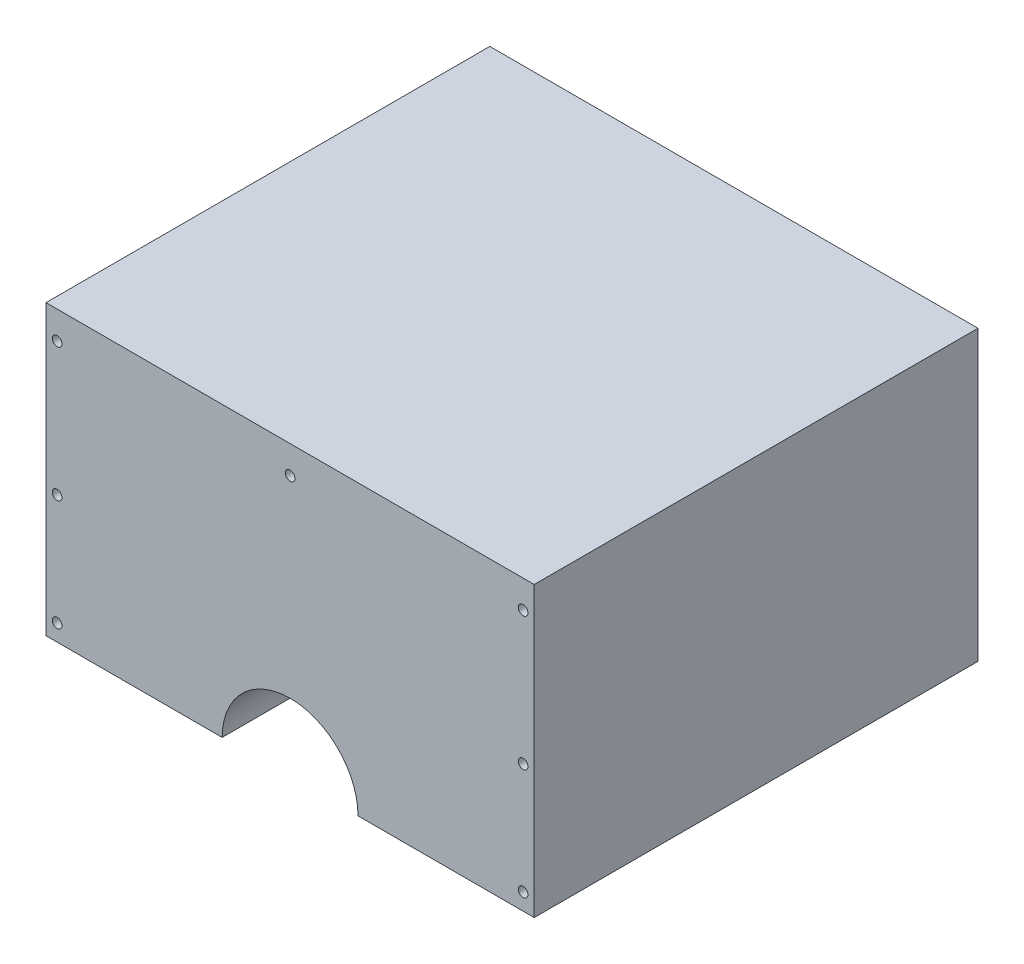
ISO-10303-21;
HEADER;
FILE_DESCRIPTION(('STEP AP214'),'2;1');
FILE_NAME('part.step','',(''),(''),'','','');
FILE_SCHEMA(('AUTOMOTIVE_DESIGN { 1 0 10303 214 1 1 1 1 }'));
ENDSEC;
DATA;
#1=APPLICATION_CONTEXT('core data for automotive mechanical design processes');
#2=APPLICATION_PROTOCOL_DEFINITION('international standard','automotive_design',2000,#1);
#3=PRODUCT_CONTEXT('',#1,'mechanical');
#4=PRODUCT('Part','Part','',(#3));
#5=PRODUCT_RELATED_PRODUCT_CATEGORY('part','',(#4));
#6=PRODUCT_DEFINITION_FORMATION('','',#4);
#7=PRODUCT_DEFINITION_CONTEXT('part definition',#1,'design');
#8=PRODUCT_DEFINITION('design','',#6,#7);
#9=PRODUCT_DEFINITION_SHAPE('','',#8);
#10=(LENGTH_UNIT() NAMED_UNIT(*) SI_UNIT(.MILLI.,.METRE.));
#11=(NAMED_UNIT(*) PLANE_ANGLE_UNIT() SI_UNIT($,.RADIAN.));
#12=(NAMED_UNIT(*) SI_UNIT($,.STERADIAN.) SOLID_ANGLE_UNIT());
#13=UNCERTAINTY_MEASURE_WITH_UNIT(LENGTH_MEASURE(1.E-05),#10,'distance_accuracy_value','');
#14=(GEOMETRIC_REPRESENTATION_CONTEXT(3) GLOBAL_UNCERTAINTY_ASSIGNED_CONTEXT((#13)) GLOBAL_UNIT_ASSIGNED_CONTEXT((#10,
#11,#12)) REPRESENTATION_CONTEXT('',''));
#15=CARTESIAN_POINT('',(0.,0.,0.));
#16=DIRECTION('',(0.,0.,1.));
#17=DIRECTION('',(1.,0.,0.));
#18=AXIS2_PLACEMENT_3D('',#15,#16,#17);
#19=CARTESIAN_POINT('',(0.,0.,254.));
#20=DIRECTION('',(0.,1.,0.));
#21=DIRECTION('',(0.,0.,1.));
#22=AXIS2_PLACEMENT_3D('',#19,#20,#21);
#23=PLANE('',#22);
#24=DIRECTION('',(0.,0.,-1.));
#25=VECTOR('',#24,1.);
#26=CARTESIAN_POINT('',(178.5874,0.,254.));
#27=LINE('',#26,#25);
#28=CARTESIAN_POINT('',(178.5874,0.,0.));
#29=VERTEX_POINT('',#28);
#30=CARTESIAN_POINT('',(178.5874,0.,254.));
#31=VERTEX_POINT('',#30);
#32=EDGE_CURVE('E99',#29,#31,#27,.F.);
#33=ORIENTED_EDGE('',*,*,#32,.F.);
#34=DIRECTION('',(1.,0.,0.));
#35=VECTOR('',#34,1.);
#36=CARTESIAN_POINT('',(0.,0.,0.));
#37=LINE('',#36,#35);
#38=CARTESIAN_POINT('',(279.4,0.,0.));
#39=VERTEX_POINT('',#38);
#40=EDGE_CURVE('E125',#29,#39,#37,.T.);
#41=ORIENTED_EDGE('',*,*,#40,.T.);
#42=DIRECTION('',(0.,0.,-1.));
#43=VECTOR('',#42,1.);
#44=CARTESIAN_POINT('',(279.4,0.,254.));
#45=LINE('',#44,#43);
#46=CARTESIAN_POINT('',(279.4,0.,254.));
#47=VERTEX_POINT('',#46);
#48=EDGE_CURVE('E47',#47,#39,#45,.T.);
#49=ORIENTED_EDGE('',*,*,#48,.F.);
#50=DIRECTION('',(1.,0.,0.));
#51=VECTOR('',#50,1.);
#52=CARTESIAN_POINT('',(0.,0.,254.));
#53=LINE('',#52,#51);
#54=EDGE_CURVE('E110',#31,#47,#53,.T.);
#55=ORIENTED_EDGE('',*,*,#54,.F.);
#56=EDGE_LOOP('',(#33,#41,#49,#55));
#57=FACE_BOUND('',#56,.T.);
#58=ADVANCED_FACE('F39',(#57),#23,.F.);
#59=DIRECTION('',(0.,0.,-1.));
#60=VECTOR('',#59,1.);
#61=CARTESIAN_POINT('',(100.8126,0.,254.));
#62=LINE('',#61,#60);
#63=CARTESIAN_POINT('',(100.8126,0.,254.));
#64=VERTEX_POINT('',#63);
#65=CARTESIAN_POINT('',(100.8126,0.,0.));
#66=VERTEX_POINT('',#65);
#67=EDGE_CURVE('E54',#64,#66,#62,.T.);
#68=ORIENTED_EDGE('',*,*,#67,.F.);
#69=CARTESIAN_POINT('',(0.,0.,254.));
#70=VERTEX_POINT('',#69);
#71=EDGE_CURVE('E90',#70,#64,#53,.T.);
#72=ORIENTED_EDGE('',*,*,#71,.F.);
#73=DIRECTION('',(0.,0.,-1.));
#74=VECTOR('',#73,1.);
#75=CARTESIAN_POINT('',(0.,0.,254.));
#76=LINE('',#75,#74);
#77=CARTESIAN_POINT('',(0.,0.,0.));
#78=VERTEX_POINT('',#77);
#79=EDGE_CURVE('E11',#70,#78,#76,.T.);
#80=ORIENTED_EDGE('',*,*,#79,.T.);
#81=EDGE_CURVE('E126',#78,#66,#37,.T.);
#82=ORIENTED_EDGE('',*,*,#81,.T.);
#83=EDGE_LOOP('',(#68,#72,#80,#82));
#84=FACE_BOUND('',#83,.T.);
#85=ADVANCED_FACE('F156',(#84),#23,.F.);
#86=CARTESIAN_POINT('',(0.,0.,254.));
#87=DIRECTION('',(1.,0.,0.));
#88=DIRECTION('',(0.,0.,-1.));
#89=AXIS2_PLACEMENT_3D('',#86,#87,#88);
#90=PLANE('',#89);
#91=DIRECTION('',(0.,-1.,0.));
#92=VECTOR('',#91,1.);
#93=CARTESIAN_POINT('',(0.,0.,0.));
#94=LINE('',#93,#92);
#95=CARTESIAN_POINT('',(0.,165.1,0.));
#96=VERTEX_POINT('',#95);
#97=EDGE_CURVE('E107',#96,#78,#94,.T.);
#98=ORIENTED_EDGE('',*,*,#97,.T.);
#99=ORIENTED_EDGE('',*,*,#79,.F.);
#100=DIRECTION('',(0.,-1.,0.));
#101=VECTOR('',#100,1.);
#102=CARTESIAN_POINT('',(0.,0.,254.));
#103=LINE('',#102,#101);
#104=CARTESIAN_POINT('',(0.,165.1,254.));
#105=VERTEX_POINT('',#104);
#106=EDGE_CURVE('E115',#105,#70,#103,.T.);
#107=ORIENTED_EDGE('',*,*,#106,.F.);
#108=DIRECTION('',(0.,0.,-1.));
#109=VECTOR('',#108,1.);
#110=CARTESIAN_POINT('',(0.,165.1,254.));
#111=LINE('',#110,#109);
#112=EDGE_CURVE('E122',#105,#96,#111,.T.);
#113=ORIENTED_EDGE('',*,*,#112,.T.);
#114=EDGE_LOOP('',(#98,#99,#107,#113));
#115=FACE_BOUND('',#114,.T.);
#116=ADVANCED_FACE('F41',(#115),#90,.F.);
#117=CARTESIAN_POINT('',(279.4,0.,254.));
#118=DIRECTION('',(-1.,0.,0.));
#119=DIRECTION('',(0.,0.,1.));
#120=AXIS2_PLACEMENT_3D('',#117,#118,#119);
#121=PLANE('',#120);
#122=DIRECTION('',(0.,1.,0.));
#123=VECTOR('',#122,1.);
#124=CARTESIAN_POINT('',(279.4,0.,0.));
#125=LINE('',#124,#123);
#126=CARTESIAN_POINT('',(279.4,165.1,0.));
#127=VERTEX_POINT('',#126);
#128=EDGE_CURVE('E129',#39,#127,#125,.T.);
#129=ORIENTED_EDGE('',*,*,#128,.T.);
#130=DIRECTION('',(0.,0.,-1.));
#131=VECTOR('',#130,1.);
#132=CARTESIAN_POINT('',(279.4,165.1,254.));
#133=LINE('',#132,#131);
#134=CARTESIAN_POINT('',(279.4,165.1,254.));
#135=VERTEX_POINT('',#134);
#136=EDGE_CURVE('E133',#135,#127,#133,.T.);
#137=ORIENTED_EDGE('',*,*,#136,.F.);
#138=DIRECTION('',(0.,1.,0.));
#139=VECTOR('',#138,1.);
#140=CARTESIAN_POINT('',(279.4,0.,254.));
#141=LINE('',#140,#139);
#142=EDGE_CURVE('E117',#47,#135,#141,.T.);
#143=ORIENTED_EDGE('',*,*,#142,.F.);
#144=ORIENTED_EDGE('',*,*,#48,.T.);
#145=EDGE_LOOP('',(#129,#137,#143,#144));
#146=FACE_BOUND('',#145,.T.);
#147=ADVANCED_FACE('F136',(#146),#121,.F.);
#148=CARTESIAN_POINT('',(0.,165.1,254.));
#149=DIRECTION('',(0.,-1.,0.));
#150=DIRECTION('',(0.,0.,-1.));
#151=AXIS2_PLACEMENT_3D('',#148,#149,#150);
#152=PLANE('',#151);
#153=DIRECTION('',(-1.,0.,0.));
#154=VECTOR('',#153,1.);
#155=CARTESIAN_POINT('',(0.,165.1,0.));
#156=LINE('',#155,#154);
#157=EDGE_CURVE('E84',#127,#96,#156,.T.);
#158=ORIENTED_EDGE('',*,*,#157,.T.);
#159=ORIENTED_EDGE('',*,*,#112,.F.);
#160=DIRECTION('',(-1.,0.,0.));
#161=VECTOR('',#160,1.);
#162=CARTESIAN_POINT('',(0.,165.1,254.));
#163=LINE('',#162,#161);
#164=EDGE_CURVE('E63',#135,#105,#163,.T.);
#165=ORIENTED_EDGE('',*,*,#164,.F.);
#166=ORIENTED_EDGE('',*,*,#136,.T.);
#167=EDGE_LOOP('',(#158,#159,#165,#166));
#168=FACE_BOUND('',#167,.T.);
#169=ADVANCED_FACE('F144',(#168),#152,.F.);
#170=CARTESIAN_POINT('',(0.,0.,254.));
#171=DIRECTION('',(0.,0.,-1.));
#172=DIRECTION('',(-1.,0.,0.));
#173=AXIS2_PLACEMENT_3D('',#170,#171,#172);
#174=PLANE('',#173);
#175=CARTESIAN_POINT('',(273.05,9.525,254.));
#176=DIRECTION('',(0.,0.,1.));
#177=DIRECTION('',(1.,0.,0.));
#178=AXIS2_PLACEMENT_3D('',#175,#176,#177);
#179=CIRCLE('',#178,2.76860000000003);
#180=CARTESIAN_POINT('',(275.8186,9.525,254.));
#181=VERTEX_POINT('',#180);
#182=EDGE_CURVE('E174',#181,#181,#179,.T.);
#183=ORIENTED_EDGE('',*,*,#182,.F.);
#184=EDGE_LOOP('',(#183));
#185=FACE_BOUND('',#184,.T.);
#186=CARTESIAN_POINT('',(6.35,9.525,254.));
#187=DIRECTION('',(0.,0.,1.));
#188=DIRECTION('',(1.,0.,0.));
#189=AXIS2_PLACEMENT_3D('',#186,#187,#188);
#190=CIRCLE('',#189,2.7686);
#191=CARTESIAN_POINT('',(9.1186,9.525,254.));
#192=VERTEX_POINT('',#191);
#193=EDGE_CURVE('E180',#192,#192,#190,.T.);
#194=ORIENTED_EDGE('',*,*,#193,.F.);
#195=EDGE_LOOP('',(#194));
#196=FACE_BOUND('',#195,.T.);
#197=CARTESIAN_POINT('',(273.05,73.025,254.));
#198=DIRECTION('',(0.,0.,1.));
#199=DIRECTION('',(1.,0.,0.));
#200=AXIS2_PLACEMENT_3D('',#197,#198,#199);
#201=CIRCLE('',#200,2.76860000000004);
#202=CARTESIAN_POINT('',(275.8186,73.025,254.));
#203=VERTEX_POINT('',#202);
#204=EDGE_CURVE('E186',#203,#203,#201,.T.);
#205=ORIENTED_EDGE('',*,*,#204,.F.);
#206=EDGE_LOOP('',(#205));
#207=FACE_BOUND('',#206,.T.);
#208=CARTESIAN_POINT('',(6.35,73.025,254.));
#209=DIRECTION('',(0.,0.,1.));
#210=DIRECTION('',(1.,0.,0.));
#211=AXIS2_PLACEMENT_3D('',#208,#209,#210);
#212=CIRCLE('',#211,2.7686);
#213=CARTESIAN_POINT('',(9.1186,73.025,254.));
#214=VERTEX_POINT('',#213);
#215=EDGE_CURVE('E192',#214,#214,#212,.T.);
#216=ORIENTED_EDGE('',*,*,#215,.F.);
#217=EDGE_LOOP('',(#216));
#218=FACE_BOUND('',#217,.T.);
#219=CARTESIAN_POINT('',(273.05,149.225,254.));
#220=DIRECTION('',(0.,0.,1.));
#221=DIRECTION('',(1.,0.,0.));
#222=AXIS2_PLACEMENT_3D('',#219,#220,#221);
#223=CIRCLE('',#222,2.76860000000004);
#224=CARTESIAN_POINT('',(275.8186,149.225,254.));
#225=VERTEX_POINT('',#224);
#226=EDGE_CURVE('E198',#225,#225,#223,.T.);
#227=ORIENTED_EDGE('',*,*,#226,.F.);
#228=EDGE_LOOP('',(#227));
#229=FACE_BOUND('',#228,.T.);
#230=CARTESIAN_POINT('',(139.7,149.225,254.));
#231=DIRECTION('',(0.,0.,1.));
#232=DIRECTION('',(1.,0.,0.));
#233=AXIS2_PLACEMENT_3D('',#230,#231,#232);
#234=CIRCLE('',#233,2.76860000000001);
#235=CARTESIAN_POINT('',(142.4686,149.225,254.));
#236=VERTEX_POINT('',#235);
#237=EDGE_CURVE('E204',#236,#236,#234,.T.);
#238=ORIENTED_EDGE('',*,*,#237,.F.);
#239=EDGE_LOOP('',(#238));
#240=FACE_BOUND('',#239,.T.);
#241=CARTESIAN_POINT('',(6.35,149.225,254.));
#242=DIRECTION('',(0.,0.,1.));
#243=DIRECTION('',(1.,0.,0.));
#244=AXIS2_PLACEMENT_3D('',#241,#242,#243);
#245=CIRCLE('',#244,2.7686);
#246=CARTESIAN_POINT('',(9.1186,149.225,254.));
#247=VERTEX_POINT('',#246);
#248=EDGE_CURVE('E166',#247,#247,#245,.T.);
#249=ORIENTED_EDGE('',*,*,#248,.F.);
#250=EDGE_LOOP('',(#249));
#251=FACE_BOUND('',#250,.T.);
#252=CARTESIAN_POINT('',(139.7,0.,254.));
#253=DIRECTION('',(0.,0.,1.));
#254=DIRECTION('',(1.,0.,0.));
#255=AXIS2_PLACEMENT_3D('',#252,#253,#254);
#256=CIRCLE('',#255,38.8874);
#257=EDGE_CURVE('E102',#31,#64,#256,.T.);
#258=ORIENTED_EDGE('',*,*,#257,.F.);
#259=ORIENTED_EDGE('',*,*,#54,.T.);
#260=ORIENTED_EDGE('',*,*,#142,.T.);
#261=ORIENTED_EDGE('',*,*,#164,.T.);
#262=ORIENTED_EDGE('',*,*,#106,.T.);
#263=ORIENTED_EDGE('',*,*,#71,.T.);
#264=EDGE_LOOP('',(#258,#259,#260,#261,#262,#263));
#265=FACE_BOUND('',#264,.T.);
#266=ADVANCED_FACE('F109',(#185,#196,#207,#218,#229,#240,#251,#265),#174,.F.);
#267=CARTESIAN_POINT('',(0.,0.,0.));
#268=DIRECTION('',(0.,0.,-1.));
#269=DIRECTION('',(-1.,0.,0.));
#270=AXIS2_PLACEMENT_3D('',#267,#268,#269);
#271=PLANE('',#270);
#272=CARTESIAN_POINT('',(273.05,9.525,0.));
#273=DIRECTION('',(0.,0.,1.));
#274=DIRECTION('',(1.,0.,0.));
#275=AXIS2_PLACEMENT_3D('',#272,#273,#274);
#276=CIRCLE('',#275,2.76860000000003);
#277=CARTESIAN_POINT('',(275.8186,9.525,0.));
#278=VERTEX_POINT('',#277);
#279=EDGE_CURVE('E177',#278,#278,#276,.T.);
#280=ORIENTED_EDGE('',*,*,#279,.T.);
#281=EDGE_LOOP('',(#280));
#282=FACE_BOUND('',#281,.T.);
#283=CARTESIAN_POINT('',(6.35,9.525,0.));
#284=DIRECTION('',(0.,0.,1.));
#285=DIRECTION('',(1.,0.,0.));
#286=AXIS2_PLACEMENT_3D('',#283,#284,#285);
#287=CIRCLE('',#286,2.7686);
#288=CARTESIAN_POINT('',(9.1186,9.525,0.));
#289=VERTEX_POINT('',#288);
#290=EDGE_CURVE('E183',#289,#289,#287,.T.);
#291=ORIENTED_EDGE('',*,*,#290,.T.);
#292=EDGE_LOOP('',(#291));
#293=FACE_BOUND('',#292,.T.);
#294=CARTESIAN_POINT('',(273.05,73.025,0.));
#295=DIRECTION('',(0.,0.,1.));
#296=DIRECTION('',(1.,0.,0.));
#297=AXIS2_PLACEMENT_3D('',#294,#295,#296);
#298=CIRCLE('',#297,2.76860000000004);
#299=CARTESIAN_POINT('',(275.8186,73.025,0.));
#300=VERTEX_POINT('',#299);
#301=EDGE_CURVE('E189',#300,#300,#298,.T.);
#302=ORIENTED_EDGE('',*,*,#301,.T.);
#303=EDGE_LOOP('',(#302));
#304=FACE_BOUND('',#303,.T.);
#305=CARTESIAN_POINT('',(6.35,73.025,0.));
#306=DIRECTION('',(0.,0.,1.));
#307=DIRECTION('',(1.,0.,0.));
#308=AXIS2_PLACEMENT_3D('',#305,#306,#307);
#309=CIRCLE('',#308,2.7686);
#310=CARTESIAN_POINT('',(9.1186,73.025,0.));
#311=VERTEX_POINT('',#310);
#312=EDGE_CURVE('E195',#311,#311,#309,.T.);
#313=ORIENTED_EDGE('',*,*,#312,.T.);
#314=EDGE_LOOP('',(#313));
#315=FACE_BOUND('',#314,.T.);
#316=CARTESIAN_POINT('',(273.05,149.225,0.));
#317=DIRECTION('',(0.,0.,1.));
#318=DIRECTION('',(1.,0.,0.));
#319=AXIS2_PLACEMENT_3D('',#316,#317,#318);
#320=CIRCLE('',#319,2.76860000000004);
#321=CARTESIAN_POINT('',(275.8186,149.225,0.));
#322=VERTEX_POINT('',#321);
#323=EDGE_CURVE('E201',#322,#322,#320,.T.);
#324=ORIENTED_EDGE('',*,*,#323,.T.);
#325=EDGE_LOOP('',(#324));
#326=FACE_BOUND('',#325,.T.);
#327=CARTESIAN_POINT('',(139.7,149.225,0.));
#328=DIRECTION('',(0.,0.,1.));
#329=DIRECTION('',(1.,0.,0.));
#330=AXIS2_PLACEMENT_3D('',#327,#328,#329);
#331=CIRCLE('',#330,2.76860000000001);
#332=CARTESIAN_POINT('',(142.4686,149.225,0.));
#333=VERTEX_POINT('',#332);
#334=EDGE_CURVE('E171',#333,#333,#331,.T.);
#335=ORIENTED_EDGE('',*,*,#334,.T.);
#336=EDGE_LOOP('',(#335));
#337=FACE_BOUND('',#336,.T.);
#338=CARTESIAN_POINT('',(6.35,149.225,0.));
#339=DIRECTION('',(0.,0.,1.));
#340=DIRECTION('',(1.,0.,0.));
#341=AXIS2_PLACEMENT_3D('',#338,#339,#340);
#342=CIRCLE('',#341,2.7686);
#343=CARTESIAN_POINT('',(9.1186,149.225,0.));
#344=VERTEX_POINT('',#343);
#345=EDGE_CURVE('E168',#344,#344,#342,.T.);
#346=ORIENTED_EDGE('',*,*,#345,.T.);
#347=EDGE_LOOP('',(#346));
#348=FACE_BOUND('',#347,.T.);
#349=ORIENTED_EDGE('',*,*,#40,.F.);
#350=CARTESIAN_POINT('',(139.7,0.,0.));
#351=DIRECTION('',(0.,0.,1.));
#352=DIRECTION('',(1.,0.,0.));
#353=AXIS2_PLACEMENT_3D('',#350,#351,#352);
#354=CIRCLE('',#353,38.8874);
#355=EDGE_CURVE('E103',#29,#66,#354,.T.);
#356=ORIENTED_EDGE('',*,*,#355,.T.);
#357=ORIENTED_EDGE('',*,*,#81,.F.);
#358=ORIENTED_EDGE('',*,*,#97,.F.);
#359=ORIENTED_EDGE('',*,*,#157,.F.);
#360=ORIENTED_EDGE('',*,*,#128,.F.);
#361=EDGE_LOOP('',(#349,#356,#357,#358,#359,#360));
#362=FACE_BOUND('',#361,.T.);
#363=ADVANCED_FACE('F139',(#282,#293,#304,#315,#326,#337,#348,#362),#271,.T.);
#364=CARTESIAN_POINT('',(139.7,0.,254.));
#365=DIRECTION('',(0.,0.,-1.));
#366=DIRECTION('',(-1.,0.,0.));
#367=AXIS2_PLACEMENT_3D('',#364,#365,#366);
#368=CYLINDRICAL_SURFACE('',#367,38.8874);
#369=ORIENTED_EDGE('',*,*,#32,.T.);
#370=ORIENTED_EDGE('',*,*,#257,.T.);
#371=ORIENTED_EDGE('',*,*,#67,.T.);
#372=ORIENTED_EDGE('',*,*,#355,.F.);
#373=EDGE_LOOP('',(#369,#370,#371,#372));
#374=FACE_BOUND('',#373,.T.);
#375=ADVANCED_FACE('F101',(#374),#368,.F.);
#376=CARTESIAN_POINT('',(6.35,149.225,254.));
#377=DIRECTION('',(0.,0.,-1.));
#378=DIRECTION('',(-1.,0.,0.));
#379=AXIS2_PLACEMENT_3D('',#376,#377,#378);
#380=CYLINDRICAL_SURFACE('',#379,2.7686);
#381=ORIENTED_EDGE('',*,*,#248,.T.);
#382=EDGE_LOOP('',(#381));
#383=FACE_BOUND('',#382,.T.);
#384=ORIENTED_EDGE('',*,*,#345,.F.);
#385=EDGE_LOOP('',(#384));
#386=FACE_BOUND('',#385,.T.);
#387=ADVANCED_FACE('F215',(#383,#386),#380,.F.);
#388=CARTESIAN_POINT('',(139.7,149.225,254.));
#389=DIRECTION('',(0.,0.,-1.));
#390=DIRECTION('',(-1.,0.,0.));
#391=AXIS2_PLACEMENT_3D('',#388,#389,#390);
#392=CYLINDRICAL_SURFACE('',#391,2.76860000000001);
#393=ORIENTED_EDGE('',*,*,#237,.T.);
#394=EDGE_LOOP('',(#393));
#395=FACE_BOUND('',#394,.T.);
#396=ORIENTED_EDGE('',*,*,#334,.F.);
#397=EDGE_LOOP('',(#396));
#398=FACE_BOUND('',#397,.T.);
#399=ADVANCED_FACE('F212',(#395,#398),#392,.F.);
#400=CARTESIAN_POINT('',(273.05,149.225,254.));
#401=DIRECTION('',(0.,0.,-1.));
#402=DIRECTION('',(-1.,0.,0.));
#403=AXIS2_PLACEMENT_3D('',#400,#401,#402);
#404=CYLINDRICAL_SURFACE('',#403,2.76860000000004);
#405=ORIENTED_EDGE('',*,*,#226,.T.);
#406=EDGE_LOOP('',(#405));
#407=FACE_BOUND('',#406,.T.);
#408=ORIENTED_EDGE('',*,*,#323,.F.);
#409=EDGE_LOOP('',(#408));
#410=FACE_BOUND('',#409,.T.);
#411=ADVANCED_FACE('F214',(#407,#410),#404,.F.);
#412=CARTESIAN_POINT('',(6.35,73.025,254.));
#413=DIRECTION('',(0.,0.,-1.));
#414=DIRECTION('',(-1.,0.,0.));
#415=AXIS2_PLACEMENT_3D('',#412,#413,#414);
#416=CYLINDRICAL_SURFACE('',#415,2.7686);
#417=ORIENTED_EDGE('',*,*,#215,.T.);
#418=EDGE_LOOP('',(#417));
#419=FACE_BOUND('',#418,.T.);
#420=ORIENTED_EDGE('',*,*,#312,.F.);
#421=EDGE_LOOP('',(#420));
#422=FACE_BOUND('',#421,.T.);
#423=ADVANCED_FACE('F222',(#419,#422),#416,.F.);
#424=CARTESIAN_POINT('',(273.05,73.025,254.));
#425=DIRECTION('',(0.,0.,-1.));
#426=DIRECTION('',(-1.,0.,0.));
#427=AXIS2_PLACEMENT_3D('',#424,#425,#426);
#428=CYLINDRICAL_SURFACE('',#427,2.76860000000004);
#429=ORIENTED_EDGE('',*,*,#204,.T.);
#430=EDGE_LOOP('',(#429));
#431=FACE_BOUND('',#430,.T.);
#432=ORIENTED_EDGE('',*,*,#301,.F.);
#433=EDGE_LOOP('',(#432));
#434=FACE_BOUND('',#433,.T.);
#435=ADVANCED_FACE('F230',(#431,#434),#428,.F.);
#436=CARTESIAN_POINT('',(6.35,9.525,254.));
#437=DIRECTION('',(0.,0.,-1.));
#438=DIRECTION('',(-1.,0.,0.));
#439=AXIS2_PLACEMENT_3D('',#436,#437,#438);
#440=CYLINDRICAL_SURFACE('',#439,2.7686);
#441=ORIENTED_EDGE('',*,*,#193,.T.);
#442=EDGE_LOOP('',(#441));
#443=FACE_BOUND('',#442,.T.);
#444=ORIENTED_EDGE('',*,*,#290,.F.);
#445=EDGE_LOOP('',(#444));
#446=FACE_BOUND('',#445,.T.);
#447=ADVANCED_FACE('F234',(#443,#446),#440,.F.);
#448=CARTESIAN_POINT('',(273.05,9.525,254.));
#449=DIRECTION('',(0.,0.,-1.));
#450=DIRECTION('',(-1.,0.,0.));
#451=AXIS2_PLACEMENT_3D('',#448,#449,#450);
#452=CYLINDRICAL_SURFACE('',#451,2.76860000000003);
#453=ORIENTED_EDGE('',*,*,#182,.T.);
#454=EDGE_LOOP('',(#453));
#455=FACE_BOUND('',#454,.T.);
#456=ORIENTED_EDGE('',*,*,#279,.F.);
#457=EDGE_LOOP('',(#456));
#458=FACE_BOUND('',#457,.T.);
#459=ADVANCED_FACE('F238',(#455,#458),#452,.F.);
#460=CLOSED_SHELL('',(#58,#85,#116,#147,#169,#266,#363,#375,#387,#399,#411,#423,#435,#447,#459));
#461=MANIFOLD_SOLID_BREP('B2',#460);
#462=ADVANCED_BREP_SHAPE_REPRESENTATION('',(#18,#461),#14);
#463=SHAPE_DEFINITION_REPRESENTATION(#9,#462);
ENDSEC;
END-ISO-10303-21;
